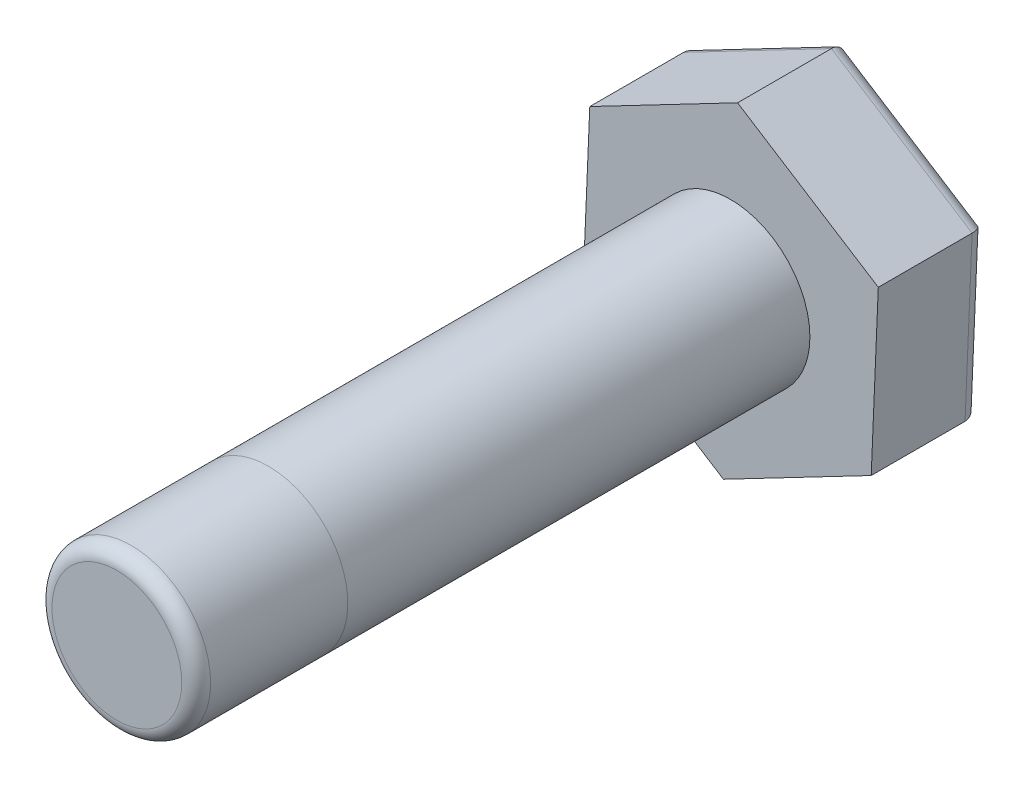
ISO-10303-21;
HEADER;
FILE_DESCRIPTION(('STEP AP214'),'2;1');
FILE_NAME('part.step','',(''),(''),'','','');
FILE_SCHEMA(('AUTOMOTIVE_DESIGN { 1 0 10303 214 1 1 1 1 }'));
ENDSEC;
DATA;
#1=APPLICATION_CONTEXT('core data for automotive mechanical design processes');
#2=APPLICATION_PROTOCOL_DEFINITION('international standard','automotive_design',2000,#1);
#3=PRODUCT_CONTEXT('',#1,'mechanical');
#4=PRODUCT('Part','Part','',(#3));
#5=PRODUCT_RELATED_PRODUCT_CATEGORY('part','',(#4));
#6=PRODUCT_DEFINITION_FORMATION('','',#4);
#7=PRODUCT_DEFINITION_CONTEXT('part definition',#1,'design');
#8=PRODUCT_DEFINITION('design','',#6,#7);
#9=PRODUCT_DEFINITION_SHAPE('','',#8);
#10=(LENGTH_UNIT() NAMED_UNIT(*) SI_UNIT(.MILLI.,.METRE.));
#11=(NAMED_UNIT(*) PLANE_ANGLE_UNIT() SI_UNIT($,.RADIAN.));
#12=(NAMED_UNIT(*) SI_UNIT($,.STERADIAN.) SOLID_ANGLE_UNIT());
#13=UNCERTAINTY_MEASURE_WITH_UNIT(LENGTH_MEASURE(1.E-05),#10,'distance_accuracy_value','');
#14=(GEOMETRIC_REPRESENTATION_CONTEXT(3) GLOBAL_UNCERTAINTY_ASSIGNED_CONTEXT((#13)) GLOBAL_UNIT_ASSIGNED_CONTEXT((#10,
#11,#12)) REPRESENTATION_CONTEXT('',''));
#15=CARTESIAN_POINT('',(0.,0.,0.));
#16=DIRECTION('',(0.,0.,1.));
#17=DIRECTION('',(1.,0.,0.));
#18=AXIS2_PLACEMENT_3D('',#15,#16,#17);
#19=CARTESIAN_POINT('',(21.4532721099387,33.7602890357432,15.));
#20=DIRECTION('',(0.,0.,1.));
#21=DIRECTION('',(1.,0.,0.));
#22=AXIS2_PLACEMENT_3D('',#19,#20,#21);
#23=PLANE('',#22);
#24=DIRECTION('',(0.0424733530908878,0.999097599975707,0.));
#25=VECTOR('',#24,1.);
#26=CARTESIAN_POINT('',(19.4915119627059,-12.3860524276714,15.));
#27=LINE('',#26,#25);
#28=CARTESIAN_POINT('',(19.4915119627059,-12.3860524276714,15.));
#29=VERTEX_POINT('',#28);
#30=CARTESIAN_POINT('',(20.4723920363223,10.6871183040359,15.));
#31=VERTEX_POINT('',#30);
#32=EDGE_CURVE('E117',#29,#31,#27,.T.);
#33=ORIENTED_EDGE('',*,*,#32,.T.);
#34=DIRECTION('',(-0.844007225893581,0.536331802748468,0.));
#35=VECTOR('',#34,1.);
#36=CARTESIAN_POINT('',(20.4723920363223,10.6871183040359,15.));
#37=LINE('',#36,#35);
#38=CARTESIAN_POINT('',(0.980880073616411,23.0731707317073,15.));
#39=VERTEX_POINT('',#38);
#40=EDGE_CURVE('E105',#31,#39,#37,.T.);
#41=ORIENTED_EDGE('',*,*,#40,.T.);
#42=DIRECTION('',(-0.886480578984469,-0.462765797227238,0.));
#43=VECTOR('',#42,1.);
#44=CARTESIAN_POINT('',(0.980880073616411,23.0731707317073,15.));
#45=LINE('',#44,#43);
#46=CARTESIAN_POINT('',(-19.4915119627059,12.3860524276714,15.));
#47=VERTEX_POINT('',#46);
#48=EDGE_CURVE('E116',#39,#47,#45,.T.);
#49=ORIENTED_EDGE('',*,*,#48,.T.);
#50=DIRECTION('',(-0.0424733530908877,-0.999097599975707,0.));
#51=VECTOR('',#50,1.);
#52=CARTESIAN_POINT('',(-19.4915119627059,12.3860524276714,15.));
#53=LINE('',#52,#51);
#54=CARTESIAN_POINT('',(-20.4723920363223,-10.6871183040359,15.));
#55=VERTEX_POINT('',#54);
#56=EDGE_CURVE('E258',#47,#55,#53,.T.);
#57=ORIENTED_EDGE('',*,*,#56,.T.);
#58=DIRECTION('',(0.844007225893581,-0.536331802748469,0.));
#59=VECTOR('',#58,1.);
#60=CARTESIAN_POINT('',(-20.4723920363223,-10.6871183040359,15.));
#61=LINE('',#60,#59);
#62=CARTESIAN_POINT('',(-0.980880073616402,-23.0731707317073,15.));
#63=VERTEX_POINT('',#62);
#64=EDGE_CURVE('E260',#55,#63,#61,.T.);
#65=ORIENTED_EDGE('',*,*,#64,.T.);
#66=DIRECTION('',(0.886480578984469,0.462765797227238,0.));
#67=VECTOR('',#66,1.);
#68=CARTESIAN_POINT('',(-0.980880073616402,-23.0731707317073,15.));
#69=LINE('',#68,#67);
#70=EDGE_CURVE('E122',#63,#29,#69,.T.);
#71=ORIENTED_EDGE('',*,*,#70,.T.);
#72=EDGE_LOOP('',(#33,#41,#49,#57,#65,#71));
#73=FACE_BOUND('',#72,.T.);
#74=CARTESIAN_POINT('',(0.,0.,15.));
#75=DIRECTION('',(0.,0.,1.));
#76=DIRECTION('',(1.,0.,0.));
#77=AXIS2_PLACEMENT_3D('',#74,#75,#76);
#78=CIRCLE('',#77,11.);
#79=CARTESIAN_POINT('',(11.,0.,15.));
#80=VERTEX_POINT('',#79);
#81=EDGE_CURVE('E172',#80,#80,#78,.T.);
#82=ORIENTED_EDGE('',*,*,#81,.F.);
#83=EDGE_LOOP('',(#82));
#84=FACE_BOUND('',#83,.T.);
#85=ADVANCED_FACE('F31',(#73,#84),#23,.T.);
#86=CARTESIAN_POINT('',(19.4915119627059,-12.3860524276714,15.));
#87=DIRECTION('',(-0.999097599975706,0.0424733530908878,0.));
#88=DIRECTION('',(-0.0424733530908878,-0.999097599975706,0.));
#89=AXIS2_PLACEMENT_3D('',#86,#87,#88);
#90=PLANE('',#89);
#91=DIRECTION('',(0.,0.,-1.));
#92=VECTOR('',#91,1.);
#93=CARTESIAN_POINT('',(19.4915119627059,-12.3860524276714,15.));
#94=LINE('',#93,#92);
#95=CARTESIAN_POINT('',(19.4915119627059,-12.3860524276714,2.));
#96=VERTEX_POINT('',#95);
#97=EDGE_CURVE('E265',#29,#96,#94,.T.);
#98=ORIENTED_EDGE('',*,*,#97,.T.);
#99=DIRECTION('',(0.0424733530908878,0.999097599975706,0.));
#100=VECTOR('',#99,1.);
#101=CARTESIAN_POINT('',(19.4915119627059,-12.3860524276714,2.));
#102=LINE('',#101,#100);
#103=CARTESIAN_POINT('',(20.4723920363223,10.6871183040359,2.));
#104=VERTEX_POINT('',#103);
#105=EDGE_CURVE('E128',#96,#104,#102,.T.);
#106=ORIENTED_EDGE('',*,*,#105,.T.);
#107=DIRECTION('',(0.,0.,-1.));
#108=VECTOR('',#107,1.);
#109=CARTESIAN_POINT('',(20.4723920363223,10.6871183040359,15.));
#110=LINE('',#109,#108);
#111=EDGE_CURVE('E110',#31,#104,#110,.T.);
#112=ORIENTED_EDGE('',*,*,#111,.F.);
#113=ORIENTED_EDGE('',*,*,#32,.F.);
#114=EDGE_LOOP('',(#98,#106,#112,#113));
#115=FACE_BOUND('',#114,.T.);
#116=ADVANCED_FACE('F126',(#115),#90,.F.);
#117=CARTESIAN_POINT('',(20.4723920363223,10.6871183040359,15.));
#118=DIRECTION('',(-0.536331802748468,-0.844007225893581,0.));
#119=DIRECTION('',(0.844007225893581,-0.536331802748468,0.));
#120=AXIS2_PLACEMENT_3D('',#117,#118,#119);
#121=PLANE('',#120);
#122=ORIENTED_EDGE('',*,*,#111,.T.);
#123=DIRECTION('',(-0.844007225893581,0.536331802748468,0.));
#124=VECTOR('',#123,1.);
#125=CARTESIAN_POINT('',(20.4723920363223,10.6871183040359,2.));
#126=LINE('',#125,#124);
#127=CARTESIAN_POINT('',(0.980880073616411,23.0731707317073,2.));
#128=VERTEX_POINT('',#127);
#129=EDGE_CURVE('E129',#104,#128,#126,.T.);
#130=ORIENTED_EDGE('',*,*,#129,.T.);
#131=DIRECTION('',(0.,0.,-1.));
#132=VECTOR('',#131,1.);
#133=CARTESIAN_POINT('',(0.980880073616411,23.0731707317073,15.));
#134=LINE('',#133,#132);
#135=EDGE_CURVE('E113',#39,#128,#134,.T.);
#136=ORIENTED_EDGE('',*,*,#135,.F.);
#137=ORIENTED_EDGE('',*,*,#40,.F.);
#138=EDGE_LOOP('',(#122,#130,#136,#137));
#139=FACE_BOUND('',#138,.T.);
#140=ADVANCED_FACE('F107',(#139),#121,.F.);
#141=CARTESIAN_POINT('',(0.980880073616411,23.0731707317073,15.));
#142=DIRECTION('',(0.462765797227238,-0.886480578984469,0.));
#143=DIRECTION('',(0.886480578984469,0.462765797227238,0.));
#144=AXIS2_PLACEMENT_3D('',#141,#142,#143);
#145=PLANE('',#144);
#146=ORIENTED_EDGE('',*,*,#135,.T.);
#147=DIRECTION('',(-0.886480578984469,-0.462765797227238,0.));
#148=VECTOR('',#147,1.);
#149=CARTESIAN_POINT('',(0.980880073616411,23.0731707317073,2.));
#150=LINE('',#149,#148);
#151=CARTESIAN_POINT('',(-19.4915119627059,12.3860524276714,2.));
#152=VERTEX_POINT('',#151);
#153=EDGE_CURVE('E149',#128,#152,#150,.T.);
#154=ORIENTED_EDGE('',*,*,#153,.T.);
#155=DIRECTION('',(0.,0.,-1.));
#156=VECTOR('',#155,1.);
#157=CARTESIAN_POINT('',(-19.4915119627059,12.3860524276714,15.));
#158=LINE('',#157,#156);
#159=EDGE_CURVE('E133',#47,#152,#158,.T.);
#160=ORIENTED_EDGE('',*,*,#159,.F.);
#161=ORIENTED_EDGE('',*,*,#48,.F.);
#162=EDGE_LOOP('',(#146,#154,#160,#161));
#163=FACE_BOUND('',#162,.T.);
#164=ADVANCED_FACE('F209',(#163),#145,.F.);
#165=CARTESIAN_POINT('',(-19.4915119627059,12.3860524276714,15.));
#166=DIRECTION('',(0.999097599975706,-0.0424733530908877,0.));
#167=DIRECTION('',(0.0424733530908877,0.999097599975706,0.));
#168=AXIS2_PLACEMENT_3D('',#165,#166,#167);
#169=PLANE('',#168);
#170=ORIENTED_EDGE('',*,*,#159,.T.);
#171=DIRECTION('',(-0.0424733530908877,-0.999097599975706,0.));
#172=VECTOR('',#171,1.);
#173=CARTESIAN_POINT('',(-19.4915119627059,12.3860524276714,2.));
#174=LINE('',#173,#172);
#175=CARTESIAN_POINT('',(-20.4723920363223,-10.6871183040359,2.));
#176=VERTEX_POINT('',#175);
#177=EDGE_CURVE('E151',#152,#176,#174,.T.);
#178=ORIENTED_EDGE('',*,*,#177,.T.);
#179=DIRECTION('',(0.,0.,-1.));
#180=VECTOR('',#179,1.);
#181=CARTESIAN_POINT('',(-20.4723920363223,-10.6871183040359,15.));
#182=LINE('',#181,#180);
#183=EDGE_CURVE('E269',#55,#176,#182,.T.);
#184=ORIENTED_EDGE('',*,*,#183,.F.);
#185=ORIENTED_EDGE('',*,*,#56,.F.);
#186=EDGE_LOOP('',(#170,#178,#184,#185));
#187=FACE_BOUND('',#186,.T.);
#188=ADVANCED_FACE('F206',(#187),#169,.F.);
#189=CARTESIAN_POINT('',(-20.4723920363223,-10.6871183040359,15.));
#190=DIRECTION('',(0.536331802748468,0.844007225893581,0.));
#191=DIRECTION('',(-0.844007225893581,0.536331802748468,0.));
#192=AXIS2_PLACEMENT_3D('',#189,#190,#191);
#193=PLANE('',#192);
#194=ORIENTED_EDGE('',*,*,#183,.T.);
#195=DIRECTION('',(0.844007225893581,-0.536331802748468,0.));
#196=VECTOR('',#195,1.);
#197=CARTESIAN_POINT('',(-20.4723920363223,-10.6871183040359,2.));
#198=LINE('',#197,#196);
#199=CARTESIAN_POINT('',(-0.980880073616402,-23.0731707317073,2.));
#200=VERTEX_POINT('',#199);
#201=EDGE_CURVE('E54',#176,#200,#198,.T.);
#202=ORIENTED_EDGE('',*,*,#201,.T.);
#203=DIRECTION('',(0.,0.,-1.));
#204=VECTOR('',#203,1.);
#205=CARTESIAN_POINT('',(-0.980880073616402,-23.0731707317073,15.));
#206=LINE('',#205,#204);
#207=EDGE_CURVE('E267',#63,#200,#206,.T.);
#208=ORIENTED_EDGE('',*,*,#207,.F.);
#209=ORIENTED_EDGE('',*,*,#64,.F.);
#210=EDGE_LOOP('',(#194,#202,#208,#209));
#211=FACE_BOUND('',#210,.T.);
#212=ADVANCED_FACE('F203',(#211),#193,.F.);
#213=CARTESIAN_POINT('',(-0.980880073616402,-23.0731707317073,15.));
#214=DIRECTION('',(-0.462765797227238,0.886480578984469,0.));
#215=DIRECTION('',(-0.886480578984469,-0.462765797227238,0.));
#216=AXIS2_PLACEMENT_3D('',#213,#214,#215);
#217=PLANE('',#216);
#218=ORIENTED_EDGE('',*,*,#207,.T.);
#219=DIRECTION('',(0.886480578984469,0.462765797227238,0.));
#220=VECTOR('',#219,1.);
#221=CARTESIAN_POINT('',(-0.980880073616402,-23.0731707317073,2.));
#222=LINE('',#221,#220);
#223=EDGE_CURVE('E46',#200,#96,#222,.T.);
#224=ORIENTED_EDGE('',*,*,#223,.T.);
#225=ORIENTED_EDGE('',*,*,#97,.F.);
#226=ORIENTED_EDGE('',*,*,#70,.F.);
#227=EDGE_LOOP('',(#218,#224,#225,#226));
#228=FACE_BOUND('',#227,.T.);
#229=ADVANCED_FACE('F199',(#228),#217,.F.);
#230=CARTESIAN_POINT('',(21.4532721099387,33.7602890357432,0.));
#231=DIRECTION('',(0.,0.,1.));
#232=DIRECTION('',(1.,0.,0.));
#233=AXIS2_PLACEMENT_3D('',#230,#231,#232);
#234=PLANE('',#233);
#235=DIRECTION('',(-0.886480578984469,-0.462765797227238,0.));
#236=VECTOR('',#235,1.);
#237=CARTESIAN_POINT('',(22.3788037043932,31.9873278777743,0.));
#238=LINE('',#237,#236);
#239=CARTESIAN_POINT('',(-17.5423607664353,11.1474471849043,0.));
#240=VERTEX_POINT('',#239);
#241=CARTESIAN_POINT('',(0.882792066254768,20.7658536585366,0.));
#242=VERTEX_POINT('',#241);
#243=EDGE_CURVE('E144',#240,#242,#238,.F.);
#244=ORIENTED_EDGE('',*,*,#243,.T.);
#245=DIRECTION('',(-0.844007225893581,0.536331802748468,0.));
#246=VECTOR('',#245,1.);
#247=CARTESIAN_POINT('',(9.65397244947244,15.1921300660844,0.));
#248=LINE('',#247,#246);
#249=CARTESIAN_POINT('',(18.4251528326901,9.61840647363232,0.));
#250=VERTEX_POINT('',#249);
#251=EDGE_CURVE('E146',#242,#250,#248,.F.);
#252=ORIENTED_EDGE('',*,*,#251,.T.);
#253=DIRECTION('',(0.0424733530908878,0.999097599975706,0.));
#254=VECTOR('',#253,1.);
#255=CARTESIAN_POINT('',(19.4550769099873,33.845235741925,0.));
#256=LINE('',#255,#254);
#257=CARTESIAN_POINT('',(17.5423607664353,-11.1474471849043,0.));
#258=VERTEX_POINT('',#257);
#259=EDGE_CURVE('E131',#250,#258,#256,.F.);
#260=ORIENTED_EDGE('',*,*,#259,.T.);
#261=DIRECTION('',(0.886480578984469,0.462765797227238,0.));
#262=VECTOR('',#261,1.);
#263=CARTESIAN_POINT('',(39.0383724045738,0.0740270343334015,0.));
#264=LINE('',#263,#262);
#265=CARTESIAN_POINT('',(-0.882792066254761,-20.7658536585366,0.));
#266=VERTEX_POINT('',#265);
#267=EDGE_CURVE('E138',#258,#266,#264,.F.);
#268=ORIENTED_EDGE('',*,*,#267,.T.);
#269=DIRECTION('',(0.844007225893581,-0.536331802748468,0.));
#270=VECTOR('',#269,1.);
#271=CARTESIAN_POINT('',(-9.65397244947243,-15.1921300660844,0.));
#272=LINE('',#271,#270);
#273=CARTESIAN_POINT('',(-18.4251528326901,-9.61840647363232,0.));
#274=VERTEX_POINT('',#273);
#275=EDGE_CURVE('E140',#266,#274,#272,.F.);
#276=ORIENTED_EDGE('',*,*,#275,.T.);
#277=DIRECTION('',(-0.0424733530908877,-0.999097599975706,0.));
#278=VECTOR('',#277,1.);
#279=CARTESIAN_POINT('',(-16.5124366891381,35.374276453197,0.));
#280=LINE('',#279,#278);
#281=EDGE_CURVE('E142',#274,#240,#280,.F.);
#282=ORIENTED_EDGE('',*,*,#281,.T.);
#283=EDGE_LOOP('',(#244,#252,#260,#268,#276,#282));
#284=FACE_BOUND('',#283,.T.);
#285=ADVANCED_FACE('F191',(#284),#234,.F.);
#286=CARTESIAN_POINT('',(0.,0.,79.));
#287=DIRECTION('',(0.,0.,-1.));
#288=DIRECTION('',(-1.,0.,0.));
#289=AXIS2_PLACEMENT_3D('',#286,#287,#288);
#290=CYLINDRICAL_SURFACE('',#289,11.);
#291=CARTESIAN_POINT('',(0.,0.,79.));
#292=DIRECTION('',(0.,0.,1.));
#293=DIRECTION('',(0.705855101372788,-0.708356249260223,0.));
#294=AXIS2_PLACEMENT_3D('',#291,#292,#293);
#295=CIRCLE('',#294,10.99);
#296=CARTESIAN_POINT('',(7.75734756408694,-7.78483517936985,79.));
#297=VERTEX_POINT('',#296);
#298=EDGE_CURVE('E124',#297,#297,#295,.T.);
#299=ORIENTED_EDGE('',*,*,#298,.F.);
#300=EDGE_LOOP('',(#299));
#301=FACE_BOUND('',#300,.T.);
#302=ORIENTED_EDGE('',*,*,#81,.T.);
#303=EDGE_LOOP('',(#302));
#304=FACE_BOUND('',#303,.T.);
#305=ADVANCED_FACE('F180',(#301,#304),#290,.T.);
#306=CARTESIAN_POINT('',(-19.3997284308254,-8.99910385224874,2.));
#307=DIRECTION('',(0.844007225893581,-0.536331802748468,0.));
#308=DIRECTION('',(0.536331802748468,0.844007225893581,0.));
#309=AXIS2_PLACEMENT_3D('',#306,#307,#308);
#310=CYLINDRICAL_SURFACE('',#309,2.);
#311=CARTESIAN_POINT('',(-18.4251528326901,-9.61840647363232,2.));
#312=DIRECTION('',(0.462765797227238,-0.886480578984469,0.));
#313=DIRECTION('',(0.886480578984469,0.462765797227238,0.));
#314=AXIS2_PLACEMENT_3D('',#311,#312,#313);
#315=ELLIPSE('',#314,2.3094010767585,2.);
#316=EDGE_CURVE('E166',#274,#176,#315,.F.);
#317=ORIENTED_EDGE('',*,*,#316,.F.);
#318=ORIENTED_EDGE('',*,*,#275,.F.);
#319=CARTESIAN_POINT('',(-0.882792066254761,-20.7658536585366,2.));
#320=DIRECTION('',(0.999097599975706,-0.042473353090888,0.));
#321=DIRECTION('',(0.042473353090888,0.999097599975707,0.));
#322=AXIS2_PLACEMENT_3D('',#319,#320,#321);
#323=ELLIPSE('',#322,2.3094010767585,2.);
#324=EDGE_CURVE('E169',#200,#266,#323,.T.);
#325=ORIENTED_EDGE('',*,*,#324,.F.);
#326=ORIENTED_EDGE('',*,*,#201,.F.);
#327=EDGE_LOOP('',(#317,#318,#325,#326));
#328=FACE_BOUND('',#327,.T.);
#329=ADVANCED_FACE('F190',(#328),#310,.T.);
#330=CARTESIAN_POINT('',(-1.90641166807088,-21.3002095737384,2.));
#331=DIRECTION('',(0.886480578984469,0.462765797227238,0.));
#332=DIRECTION('',(-0.462765797227238,0.886480578984469,0.));
#333=AXIS2_PLACEMENT_3D('',#330,#331,#332);
#334=CYLINDRICAL_SURFACE('',#333,2.);
#335=ORIENTED_EDGE('',*,*,#324,.T.);
#336=ORIENTED_EDGE('',*,*,#267,.F.);
#337=CARTESIAN_POINT('',(17.5423607664353,-11.1474471849043,2.));
#338=DIRECTION('',(0.536331802748468,0.844007225893581,0.));
#339=DIRECTION('',(-0.844007225893581,0.536331802748469,0.));
#340=AXIS2_PLACEMENT_3D('',#337,#338,#339);
#341=ELLIPSE('',#340,2.3094010767585,2.);
#342=EDGE_CURVE('E163',#96,#258,#341,.T.);
#343=ORIENTED_EDGE('',*,*,#342,.F.);
#344=ORIENTED_EDGE('',*,*,#223,.F.);
#345=EDGE_LOOP('',(#335,#336,#343,#344));
#346=FACE_BOUND('',#345,.T.);
#347=ADVANCED_FACE('F233',(#346),#334,.T.);
#348=CARTESIAN_POINT('',(-17.4933167627545,12.3011057214896,2.));
#349=DIRECTION('',(-0.0424733530908877,-0.999097599975706,0.));
#350=DIRECTION('',(0.999097599975706,-0.0424733530908877,0.));
#351=AXIS2_PLACEMENT_3D('',#348,#349,#350);
#352=CYLINDRICAL_SURFACE('',#351,2.);
#353=ORIENTED_EDGE('',*,*,#316,.T.);
#354=ORIENTED_EDGE('',*,*,#177,.F.);
#355=CARTESIAN_POINT('',(-17.5423607664353,11.1474471849043,2.));
#356=DIRECTION('',(-0.536331802748468,-0.844007225893581,0.));
#357=DIRECTION('',(0.844007225893581,-0.536331802748468,0.));
#358=AXIS2_PLACEMENT_3D('',#355,#356,#357);
#359=ELLIPSE('',#358,2.3094010767585,2.);
#360=EDGE_CURVE('E160',#240,#152,#359,.F.);
#361=ORIENTED_EDGE('',*,*,#360,.F.);
#362=ORIENTED_EDGE('',*,*,#281,.F.);
#363=EDGE_LOOP('',(#353,#354,#361,#362));
#364=FACE_BOUND('',#363,.T.);
#365=ADVANCED_FACE('F229',(#364),#352,.T.);
#366=CARTESIAN_POINT('',(17.4933167627545,-12.3011057214897,2.));
#367=DIRECTION('',(0.0424733530908878,0.999097599975706,0.));
#368=DIRECTION('',(-0.999097599975706,0.0424733530908878,0.));
#369=AXIS2_PLACEMENT_3D('',#366,#367,#368);
#370=CYLINDRICAL_SURFACE('',#369,2.);
#371=ORIENTED_EDGE('',*,*,#342,.T.);
#372=ORIENTED_EDGE('',*,*,#259,.F.);
#373=CARTESIAN_POINT('',(18.4251528326901,9.61840647363231,2.));
#374=DIRECTION('',(-0.462765797227238,0.886480578984469,0.));
#375=DIRECTION('',(0.886480578984469,0.462765797227238,0.));
#376=AXIS2_PLACEMENT_3D('',#373,#374,#375);
#377=ELLIPSE('',#376,2.3094010767585,2.);
#378=EDGE_CURVE('E158',#104,#250,#377,.T.);
#379=ORIENTED_EDGE('',*,*,#378,.F.);
#380=ORIENTED_EDGE('',*,*,#105,.F.);
#381=EDGE_LOOP('',(#371,#372,#379,#380));
#382=FACE_BOUND('',#381,.T.);
#383=ADVANCED_FACE('F225',(#382),#370,.T.);
#384=CARTESIAN_POINT('',(1.90641166807089,21.3002095737384,2.));
#385=DIRECTION('',(-0.886480578984469,-0.462765797227238,0.));
#386=DIRECTION('',(0.462765797227238,-0.886480578984469,0.));
#387=AXIS2_PLACEMENT_3D('',#384,#385,#386);
#388=CYLINDRICAL_SURFACE('',#387,2.);
#389=ORIENTED_EDGE('',*,*,#360,.T.);
#390=ORIENTED_EDGE('',*,*,#153,.F.);
#391=CARTESIAN_POINT('',(0.882792066254761,20.7658536585366,2.));
#392=DIRECTION('',(-0.999097599975706,0.042473353090888,0.));
#393=DIRECTION('',(-0.0424733530908879,-0.999097599975706,0.));
#394=AXIS2_PLACEMENT_3D('',#391,#392,#393);
#395=ELLIPSE('',#394,2.3094010767585,2.);
#396=EDGE_CURVE('E156',#242,#128,#395,.F.);
#397=ORIENTED_EDGE('',*,*,#396,.F.);
#398=ORIENTED_EDGE('',*,*,#243,.F.);
#399=EDGE_LOOP('',(#389,#390,#397,#398));
#400=FACE_BOUND('',#399,.T.);
#401=ADVANCED_FACE('F221',(#400),#388,.T.);
#402=CARTESIAN_POINT('',(19.3997284308254,8.99910385224875,2.));
#403=DIRECTION('',(-0.844007225893581,0.536331802748468,0.));
#404=DIRECTION('',(-0.536331802748468,-0.844007225893581,0.));
#405=AXIS2_PLACEMENT_3D('',#402,#403,#404);
#406=CYLINDRICAL_SURFACE('',#405,2.);
#407=ORIENTED_EDGE('',*,*,#378,.T.);
#408=ORIENTED_EDGE('',*,*,#251,.F.);
#409=ORIENTED_EDGE('',*,*,#396,.T.);
#410=ORIENTED_EDGE('',*,*,#129,.F.);
#411=EDGE_LOOP('',(#407,#408,#409,#410));
#412=FACE_BOUND('',#411,.T.);
#413=ADVANCED_FACE('F218',(#412),#406,.T.);
#414=CARTESIAN_POINT('',(0.,0.,100.));
#415=DIRECTION('',(0.,0.,-1.));
#416=DIRECTION('',(-1.,0.,0.));
#417=AXIS2_PLACEMENT_3D('',#414,#415,#416);
#418=CYLINDRICAL_SURFACE('',#417,10.99);
#419=CARTESIAN_POINT('',(0.,0.,98.));
#420=DIRECTION('',(0.,0.,1.));
#421=DIRECTION('',(1.,0.,0.));
#422=AXIS2_PLACEMENT_3D('',#419,#420,#421);
#423=CIRCLE('',#422,10.99);
#424=CARTESIAN_POINT('',(10.99,0.,98.));
#425=VERTEX_POINT('',#424);
#426=EDGE_CURVE('E11',#425,#425,#423,.F.);
#427=ORIENTED_EDGE('',*,*,#426,.T.);
#428=EDGE_LOOP('',(#427));
#429=FACE_BOUND('',#428,.T.);
#430=ORIENTED_EDGE('',*,*,#298,.T.);
#431=EDGE_LOOP('',(#430));
#432=FACE_BOUND('',#431,.T.);
#433=ADVANCED_FACE('F192',(#429,#432),#418,.T.);
#434=CARTESIAN_POINT('',(0.,0.,100.));
#435=DIRECTION('',(0.,0.,1.));
#436=DIRECTION('',(1.,0.,0.));
#437=AXIS2_PLACEMENT_3D('',#434,#435,#436);
#438=PLANE('',#437);
#439=CARTESIAN_POINT('',(0.,0.,100.));
#440=DIRECTION('',(0.,0.,1.));
#441=DIRECTION('',(1.,0.,0.));
#442=AXIS2_PLACEMENT_3D('',#439,#440,#441);
#443=CIRCLE('',#442,8.99);
#444=CARTESIAN_POINT('',(8.99,0.,100.));
#445=VERTEX_POINT('',#444);
#446=EDGE_CURVE('E39',#445,#445,#443,.T.);
#447=ORIENTED_EDGE('',*,*,#446,.T.);
#448=EDGE_LOOP('',(#447));
#449=FACE_BOUND('',#448,.T.);
#450=ADVANCED_FACE('F285',(#449),#438,.T.);
#451=CARTESIAN_POINT('',(0.,0.,98.));
#452=DIRECTION('',(0.,0.,1.));
#453=DIRECTION('',(1.,0.,0.));
#454=AXIS2_PLACEMENT_3D('',#451,#452,#453);
#455=TOROIDAL_SURFACE('',#454,8.99,2.);
#456=ORIENTED_EDGE('',*,*,#426,.F.);
#457=EDGE_LOOP('',(#456));
#458=FACE_BOUND('',#457,.T.);
#459=ORIENTED_EDGE('',*,*,#446,.F.);
#460=EDGE_LOOP('',(#459));
#461=FACE_BOUND('',#460,.T.);
#462=ADVANCED_FACE('F33',(#458,#461),#455,.T.);
#463=CLOSED_SHELL('',(#85,#116,#140,#164,#188,#212,#229,#285,#305,#329,#347,#365,#383,#401,#413,
#433,#450,#462));
#464=MANIFOLD_SOLID_BREP('B2',#463);
#465=ADVANCED_BREP_SHAPE_REPRESENTATION('',(#18,#464),#14);
#466=SHAPE_DEFINITION_REPRESENTATION(#9,#465);
ENDSEC;
END-ISO-10303-21;
